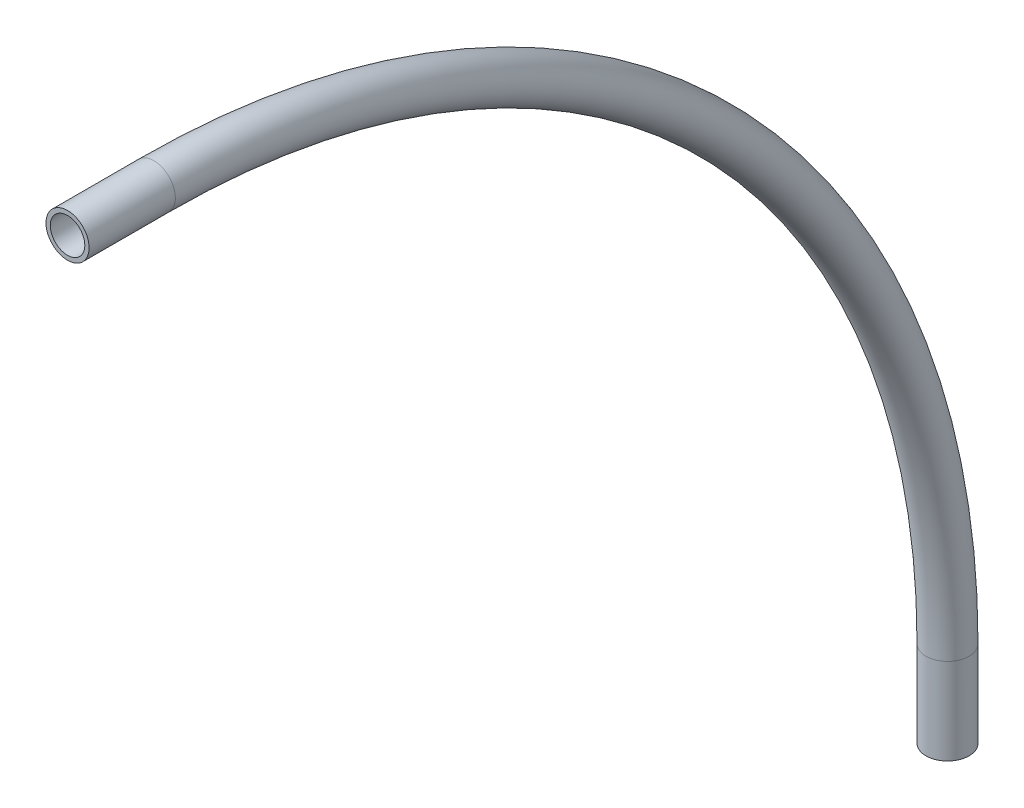
ISO-10303-21;
HEADER;
FILE_DESCRIPTION(('STEP AP214'),'2;1');
FILE_NAME('part.step','',(''),(''),'','','');
FILE_SCHEMA(('AUTOMOTIVE_DESIGN { 1 0 10303 214 1 1 1 1 }'));
ENDSEC;
DATA;
#1=APPLICATION_CONTEXT('core data for automotive mechanical design processes');
#2=APPLICATION_PROTOCOL_DEFINITION('international standard','automotive_design',2000,#1);
#3=PRODUCT_CONTEXT('',#1,'mechanical');
#4=PRODUCT('Part','Part','',(#3));
#5=PRODUCT_RELATED_PRODUCT_CATEGORY('part','',(#4));
#6=PRODUCT_DEFINITION_FORMATION('','',#4);
#7=PRODUCT_DEFINITION_CONTEXT('part definition',#1,'design');
#8=PRODUCT_DEFINITION('design','',#6,#7);
#9=PRODUCT_DEFINITION_SHAPE('','',#8);
#10=(LENGTH_UNIT() NAMED_UNIT(*) SI_UNIT(.MILLI.,.METRE.));
#11=(NAMED_UNIT(*) PLANE_ANGLE_UNIT() SI_UNIT($,.RADIAN.));
#12=(NAMED_UNIT(*) SI_UNIT($,.STERADIAN.) SOLID_ANGLE_UNIT());
#13=UNCERTAINTY_MEASURE_WITH_UNIT(LENGTH_MEASURE(1.E-05),#10,'distance_accuracy_value','');
#14=(GEOMETRIC_REPRESENTATION_CONTEXT(3) GLOBAL_UNCERTAINTY_ASSIGNED_CONTEXT((#13)) GLOBAL_UNIT_ASSIGNED_CONTEXT((#10,
#11,#12)) REPRESENTATION_CONTEXT('',''));
#15=CARTESIAN_POINT('',(0.,0.,0.));
#16=DIRECTION('',(0.,0.,1.));
#17=DIRECTION('',(1.,0.,0.));
#18=AXIS2_PLACEMENT_3D('',#15,#16,#17);
#19=CARTESIAN_POINT('',(0.,0.,0.));
#20=DIRECTION('',(0.,0.,-1.));
#21=DIRECTION('',(0.,1.,0.));
#22=AXIS2_PLACEMENT_3D('',#19,#20,#21);
#23=CYLINDRICAL_SURFACE('',#22,3.175);
#24=CARTESIAN_POINT('',(0.,0.,-12.7));
#25=DIRECTION('',(0.,0.,1.));
#26=DIRECTION('',(1.,0.,0.));
#27=AXIS2_PLACEMENT_3D('',#24,#25,#26);
#28=CIRCLE('',#27,3.175);
#29=CARTESIAN_POINT('',(0.,3.17500000000001,-12.7));
#30=VERTEX_POINT('',#29);
#31=EDGE_CURVE('E111',#30,#30,#28,.T.);
#32=ORIENTED_EDGE('',*,*,#31,.T.);
#33=EDGE_LOOP('',(#32));
#34=FACE_BOUND('',#33,.T.);
#35=CARTESIAN_POINT('',(0.,0.,0.));
#36=DIRECTION('',(0.,0.,1.));
#37=DIRECTION('',(1.,0.,0.));
#38=AXIS2_PLACEMENT_3D('',#35,#36,#37);
#39=CIRCLE('',#38,3.175);
#40=CARTESIAN_POINT('',(3.175,0.,0.));
#41=VERTEX_POINT('',#40);
#42=EDGE_CURVE('E55',#41,#41,#39,.T.);
#43=ORIENTED_EDGE('',*,*,#42,.F.);
#44=EDGE_LOOP('',(#43));
#45=FACE_BOUND('',#44,.T.);
#46=ADVANCED_FACE('F39',(#34,#45),#23,.T.);
#47=CARTESIAN_POINT('',(0.,-116.84,-12.7));
#48=DIRECTION('',(-1.,0.,0.));
#49=DIRECTION('',(0.,0.,1.));
#50=AXIS2_PLACEMENT_3D('',#47,#48,#49);
#51=TOROIDAL_SURFACE('',#50,116.84,3.175);
#52=CARTESIAN_POINT('',(0.,-116.840000000001,-129.54));
#53=DIRECTION('',(0.,1.,0.));
#54=DIRECTION('',(1.,0.,0.));
#55=AXIS2_PLACEMENT_3D('',#52,#53,#54);
#56=CIRCLE('',#55,3.175);
#57=CARTESIAN_POINT('',(0.,-116.840000000001,-132.715));
#58=VERTEX_POINT('',#57);
#59=EDGE_CURVE('E43',#58,#58,#56,.T.);
#60=CARTESIAN_POINT('',(0.,-116.84,-12.7));
#61=DIRECTION('',(-1.,0.,0.));
#62=DIRECTION('',(0.,0.,1.));
#63=AXIS2_PLACEMENT_3D('',#60,#61,#62);
#64=CIRCLE('',#63,120.015);
#65=EDGE_CURVE('',#30,#58,#64,.T.);
#66=ORIENTED_EDGE('',*,*,#31,.F.);
#67=ORIENTED_EDGE('',*,*,#59,.T.);
#68=ORIENTED_EDGE('',*,*,#65,.T.);
#69=ORIENTED_EDGE('',*,*,#65,.F.);
#70=EDGE_LOOP('',(#66,#68,#67,#69));
#71=FACE_BOUND('',#70,.T.);
#72=ADVANCED_FACE('F120',(#71),#51,.T.);
#73=CARTESIAN_POINT('',(0.,-116.840000000001,-129.54));
#74=DIRECTION('',(0.,-1.,0.));
#75=DIRECTION('',(0.,0.,-1.));
#76=AXIS2_PLACEMENT_3D('',#73,#74,#75);
#77=CYLINDRICAL_SURFACE('',#76,3.175);
#78=CARTESIAN_POINT('',(0.,-129.540000000001,-129.54));
#79=DIRECTION('',(0.,1.,0.));
#80=DIRECTION('',(1.,0.,0.));
#81=AXIS2_PLACEMENT_3D('',#78,#79,#80);
#82=CIRCLE('',#81,3.175);
#83=CARTESIAN_POINT('',(3.175,-129.540000000001,-129.54));
#84=VERTEX_POINT('',#83);
#85=EDGE_CURVE('E60',#84,#84,#82,.T.);
#86=ORIENTED_EDGE('',*,*,#85,.T.);
#87=EDGE_LOOP('',(#86));
#88=FACE_BOUND('',#87,.T.);
#89=ORIENTED_EDGE('',*,*,#59,.F.);
#90=EDGE_LOOP('',(#89));
#91=FACE_BOUND('',#90,.T.);
#92=ADVANCED_FACE('F41',(#88,#91),#77,.T.);
#93=CARTESIAN_POINT('',(0.,0.,0.));
#94=DIRECTION('',(0.,0.,1.));
#95=DIRECTION('',(1.,0.,0.));
#96=AXIS2_PLACEMENT_3D('',#93,#94,#95);
#97=PLANE('',#96);
#98=CARTESIAN_POINT('',(0.,0.,0.));
#99=DIRECTION('',(0.,0.,1.));
#100=DIRECTION('',(1.,0.,0.));
#101=AXIS2_PLACEMENT_3D('',#98,#99,#100);
#102=CIRCLE('',#101,2.54);
#103=CARTESIAN_POINT('',(2.54,0.,0.));
#104=VERTEX_POINT('',#103);
#105=EDGE_CURVE('E100',#104,#104,#102,.F.);
#106=ORIENTED_EDGE('',*,*,#105,.T.);
#107=EDGE_LOOP('',(#106));
#108=FACE_BOUND('',#107,.T.);
#109=ORIENTED_EDGE('',*,*,#42,.T.);
#110=EDGE_LOOP('',(#109));
#111=FACE_BOUND('',#110,.T.);
#112=ADVANCED_FACE('F73',(#108,#111),#97,.T.);
#113=CARTESIAN_POINT('',(0.,-129.540000000001,-129.54));
#114=DIRECTION('',(0.,1.,0.));
#115=DIRECTION('',(1.,0.,0.));
#116=AXIS2_PLACEMENT_3D('',#113,#114,#115);
#117=PLANE('',#116);
#118=CARTESIAN_POINT('',(0.,-129.540000000001,-129.54));
#119=DIRECTION('',(0.,1.,0.));
#120=DIRECTION('',(1.,0.,0.));
#121=AXIS2_PLACEMENT_3D('',#118,#119,#120);
#122=CIRCLE('',#121,2.54);
#123=CARTESIAN_POINT('',(2.54,-129.540000000001,-129.54));
#124=VERTEX_POINT('',#123);
#125=EDGE_CURVE('E11',#124,#124,#122,.F.);
#126=ORIENTED_EDGE('',*,*,#125,.F.);
#127=EDGE_LOOP('',(#126));
#128=FACE_BOUND('',#127,.T.);
#129=ORIENTED_EDGE('',*,*,#85,.F.);
#130=EDGE_LOOP('',(#129));
#131=FACE_BOUND('',#130,.T.);
#132=ADVANCED_FACE('F70',(#128,#131),#117,.F.);
#133=CARTESIAN_POINT('',(0.,0.,0.));
#134=DIRECTION('',(0.,0.,-1.));
#135=DIRECTION('',(0.,1.,0.));
#136=AXIS2_PLACEMENT_3D('',#133,#134,#135);
#137=CYLINDRICAL_SURFACE('',#136,2.54);
#138=CARTESIAN_POINT('',(0.,0.,-12.7));
#139=DIRECTION('',(0.,0.,1.));
#140=DIRECTION('',(1.,0.,0.));
#141=AXIS2_PLACEMENT_3D('',#138,#139,#140);
#142=CIRCLE('',#141,2.54);
#143=CARTESIAN_POINT('',(0.,2.54000000000001,-12.7));
#144=VERTEX_POINT('',#143);
#145=EDGE_CURVE('E98',#144,#144,#142,.F.);
#146=ORIENTED_EDGE('',*,*,#145,.T.);
#147=EDGE_LOOP('',(#146));
#148=FACE_BOUND('',#147,.T.);
#149=ORIENTED_EDGE('',*,*,#105,.F.);
#150=EDGE_LOOP('',(#149));
#151=FACE_BOUND('',#150,.T.);
#152=ADVANCED_FACE('F72',(#148,#151),#137,.F.);
#153=CARTESIAN_POINT('',(0.,-116.84,-12.7));
#154=DIRECTION('',(-1.,0.,0.));
#155=DIRECTION('',(0.,0.,1.));
#156=AXIS2_PLACEMENT_3D('',#153,#154,#155);
#157=TOROIDAL_SURFACE('',#156,116.84,2.54);
#158=CARTESIAN_POINT('',(0.,-116.840000000001,-129.54));
#159=DIRECTION('',(0.,1.,0.));
#160=DIRECTION('',(1.,0.,0.));
#161=AXIS2_PLACEMENT_3D('',#158,#159,#160);
#162=CIRCLE('',#161,2.54);
#163=CARTESIAN_POINT('',(0.,-116.840000000001,-132.08));
#164=VERTEX_POINT('',#163);
#165=EDGE_CURVE('E49',#164,#164,#162,.F.);
#166=CARTESIAN_POINT('',(0.,-116.84,-12.7));
#167=DIRECTION('',(-1.,0.,0.));
#168=DIRECTION('',(0.,0.,1.));
#169=AXIS2_PLACEMENT_3D('',#166,#167,#168);
#170=CIRCLE('',#169,119.38);
#171=EDGE_CURVE('',#144,#164,#170,.T.);
#172=ORIENTED_EDGE('',*,*,#145,.F.);
#173=ORIENTED_EDGE('',*,*,#165,.T.);
#174=ORIENTED_EDGE('',*,*,#171,.T.);
#175=ORIENTED_EDGE('',*,*,#171,.F.);
#176=EDGE_LOOP('',(#172,#174,#173,#175));
#177=FACE_BOUND('',#176,.T.);
#178=ADVANCED_FACE('F79',(#177),#157,.F.);
#179=CARTESIAN_POINT('',(0.,-116.840000000001,-129.54));
#180=DIRECTION('',(0.,-1.,0.));
#181=DIRECTION('',(0.,0.,-1.));
#182=AXIS2_PLACEMENT_3D('',#179,#180,#181);
#183=CYLINDRICAL_SURFACE('',#182,2.54);
#184=ORIENTED_EDGE('',*,*,#125,.T.);
#185=EDGE_LOOP('',(#184));
#186=FACE_BOUND('',#185,.T.);
#187=ORIENTED_EDGE('',*,*,#165,.F.);
#188=EDGE_LOOP('',(#187));
#189=FACE_BOUND('',#188,.T.);
#190=ADVANCED_FACE('F67',(#186,#189),#183,.F.);
#191=CLOSED_SHELL('',(#46,#72,#92,#112,#132,#152,#178,#190));
#192=MANIFOLD_SOLID_BREP('B2',#191);
#193=ADVANCED_BREP_SHAPE_REPRESENTATION('',(#18,#192),#14);
#194=SHAPE_DEFINITION_REPRESENTATION(#9,#193);
ENDSEC;
END-ISO-10303-21;
